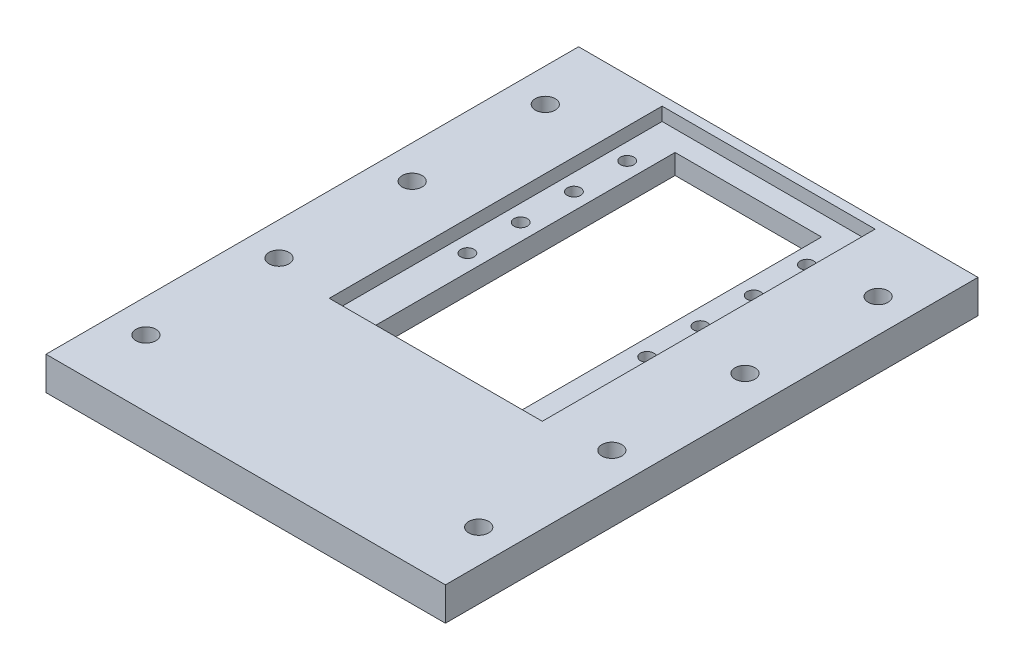
ISO-10303-21;
HEADER;
FILE_DESCRIPTION(('STEP AP214'),'2;1');
FILE_NAME('part.step','',(''),(''),'','','');
FILE_SCHEMA(('AUTOMOTIVE_DESIGN { 1 0 10303 214 1 1 1 1 }'));
ENDSEC;
DATA;
#1=APPLICATION_CONTEXT('core data for automotive mechanical design processes');
#2=APPLICATION_PROTOCOL_DEFINITION('international standard','automotive_design',2000,#1);
#3=PRODUCT_CONTEXT('',#1,'mechanical');
#4=PRODUCT('Part','Part','',(#3));
#5=PRODUCT_RELATED_PRODUCT_CATEGORY('part','',(#4));
#6=PRODUCT_DEFINITION_FORMATION('','',#4);
#7=PRODUCT_DEFINITION_CONTEXT('part definition',#1,'design');
#8=PRODUCT_DEFINITION('design','',#6,#7);
#9=PRODUCT_DEFINITION_SHAPE('','',#8);
#10=(LENGTH_UNIT() NAMED_UNIT(*) SI_UNIT(.MILLI.,.METRE.));
#11=(NAMED_UNIT(*) PLANE_ANGLE_UNIT() SI_UNIT($,.RADIAN.));
#12=(NAMED_UNIT(*) SI_UNIT($,.STERADIAN.) SOLID_ANGLE_UNIT());
#13=UNCERTAINTY_MEASURE_WITH_UNIT(LENGTH_MEASURE(1.E-05),#10,'distance_accuracy_value','');
#14=(GEOMETRIC_REPRESENTATION_CONTEXT(3) GLOBAL_UNCERTAINTY_ASSIGNED_CONTEXT((#13)) GLOBAL_UNIT_ASSIGNED_CONTEXT((#10,
#11,#12)) REPRESENTATION_CONTEXT('',''));
#15=CARTESIAN_POINT('',(0.,0.,0.));
#16=DIRECTION('',(0.,0.,1.));
#17=DIRECTION('',(1.,0.,0.));
#18=AXIS2_PLACEMENT_3D('',#15,#16,#17);
#19=CARTESIAN_POINT('',(-13.5000000000002,5.,-22.8));
#20=DIRECTION('',(0.,-1.,0.));
#21=DIRECTION('',(0.,0.,-1.));
#22=AXIS2_PLACEMENT_3D('',#19,#20,#21);
#23=CYLINDRICAL_SURFACE('',#22,1.00000000000014);
#24=CARTESIAN_POINT('',(-13.5000000000002,0.,-22.8));
#25=DIRECTION('',(0.,1.,0.));
#26=DIRECTION('',(0.,0.,1.));
#27=AXIS2_PLACEMENT_3D('',#24,#25,#26);
#28=CIRCLE('',#27,1.00000000000014);
#29=CARTESIAN_POINT('',(-13.5000000000002,0.,-21.7999999999999));
#30=VERTEX_POINT('',#29);
#31=EDGE_CURVE('E343',#30,#30,#28,.T.);
#32=ORIENTED_EDGE('',*,*,#31,.F.);
#33=EDGE_LOOP('',(#32));
#34=FACE_BOUND('',#33,.T.);
#35=CARTESIAN_POINT('',(-13.5000000000002,3.,-22.8));
#36=DIRECTION('',(0.,1.,0.));
#37=DIRECTION('',(0.,0.,1.));
#38=AXIS2_PLACEMENT_3D('',#35,#36,#37);
#39=CIRCLE('',#38,1.00000000000014);
#40=CARTESIAN_POINT('',(-13.5000000000002,3.,-21.7999999999999));
#41=VERTEX_POINT('',#40);
#42=EDGE_CURVE('E219',#41,#41,#39,.T.);
#43=ORIENTED_EDGE('',*,*,#42,.T.);
#44=EDGE_LOOP('',(#43));
#45=FACE_BOUND('',#44,.T.);
#46=ADVANCED_FACE('F42',(#34,#45),#23,.F.);
#47=CARTESIAN_POINT('',(13.4999999999998,5.,-22.8));
#48=DIRECTION('',(0.,-1.,0.));
#49=DIRECTION('',(0.,0.,-1.));
#50=AXIS2_PLACEMENT_3D('',#47,#48,#49);
#51=CYLINDRICAL_SURFACE('',#50,1.00000000000014);
#52=CARTESIAN_POINT('',(13.4999999999998,0.,-22.8));
#53=DIRECTION('',(0.,1.,0.));
#54=DIRECTION('',(0.,0.,1.));
#55=AXIS2_PLACEMENT_3D('',#52,#53,#54);
#56=CIRCLE('',#55,1.00000000000014);
#57=CARTESIAN_POINT('',(13.4999999999998,0.,-21.7999999999999));
#58=VERTEX_POINT('',#57);
#59=EDGE_CURVE('E339',#58,#58,#56,.T.);
#60=ORIENTED_EDGE('',*,*,#59,.F.);
#61=EDGE_LOOP('',(#60));
#62=FACE_BOUND('',#61,.T.);
#63=CARTESIAN_POINT('',(13.4999999999998,3.,-22.8));
#64=DIRECTION('',(0.,1.,0.));
#65=DIRECTION('',(0.,0.,1.));
#66=AXIS2_PLACEMENT_3D('',#63,#64,#65);
#67=CIRCLE('',#66,1.00000000000014);
#68=CARTESIAN_POINT('',(13.4999999999998,3.,-21.7999999999999));
#69=VERTEX_POINT('',#68);
#70=EDGE_CURVE('E215',#69,#69,#67,.T.);
#71=ORIENTED_EDGE('',*,*,#70,.T.);
#72=EDGE_LOOP('',(#71));
#73=FACE_BOUND('',#72,.T.);
#74=ADVANCED_FACE('F438',(#62,#73),#51,.F.);
#75=CARTESIAN_POINT('',(-13.5000000000002,5.,-14.8));
#76=DIRECTION('',(0.,-1.,0.));
#77=DIRECTION('',(0.,0.,-1.));
#78=AXIS2_PLACEMENT_3D('',#75,#76,#77);
#79=CYLINDRICAL_SURFACE('',#78,1.);
#80=CARTESIAN_POINT('',(-13.5000000000002,0.,-14.8));
#81=DIRECTION('',(0.,1.,0.));
#82=DIRECTION('',(0.,0.,1.));
#83=AXIS2_PLACEMENT_3D('',#80,#81,#82);
#84=CIRCLE('',#83,1.);
#85=CARTESIAN_POINT('',(-13.5000000000002,0.,-13.8));
#86=VERTEX_POINT('',#85);
#87=EDGE_CURVE('E335',#86,#86,#84,.T.);
#88=ORIENTED_EDGE('',*,*,#87,.F.);
#89=EDGE_LOOP('',(#88));
#90=FACE_BOUND('',#89,.T.);
#91=CARTESIAN_POINT('',(-13.5000000000002,3.,-14.8));
#92=DIRECTION('',(0.,1.,0.));
#93=DIRECTION('',(0.,0.,1.));
#94=AXIS2_PLACEMENT_3D('',#91,#92,#93);
#95=CIRCLE('',#94,1.);
#96=CARTESIAN_POINT('',(-13.5000000000002,3.,-13.8));
#97=VERTEX_POINT('',#96);
#98=EDGE_CURVE('E211',#97,#97,#95,.T.);
#99=ORIENTED_EDGE('',*,*,#98,.T.);
#100=EDGE_LOOP('',(#99));
#101=FACE_BOUND('',#100,.T.);
#102=ADVANCED_FACE('F445',(#90,#101),#79,.F.);
#103=CARTESIAN_POINT('',(-13.5000000000001,5.,-6.8));
#104=DIRECTION('',(0.,-1.,0.));
#105=DIRECTION('',(0.,0.,-1.));
#106=AXIS2_PLACEMENT_3D('',#103,#104,#105);
#107=CYLINDRICAL_SURFACE('',#106,1.);
#108=CARTESIAN_POINT('',(-13.5000000000001,0.,-6.8));
#109=DIRECTION('',(0.,1.,0.));
#110=DIRECTION('',(0.,0.,1.));
#111=AXIS2_PLACEMENT_3D('',#108,#109,#110);
#112=CIRCLE('',#111,1.);
#113=CARTESIAN_POINT('',(-13.5000000000001,0.,-5.8));
#114=VERTEX_POINT('',#113);
#115=EDGE_CURVE('E331',#114,#114,#112,.T.);
#116=ORIENTED_EDGE('',*,*,#115,.F.);
#117=EDGE_LOOP('',(#116));
#118=FACE_BOUND('',#117,.T.);
#119=CARTESIAN_POINT('',(-13.5000000000001,3.,-6.8));
#120=DIRECTION('',(0.,1.,0.));
#121=DIRECTION('',(0.,0.,1.));
#122=AXIS2_PLACEMENT_3D('',#119,#120,#121);
#123=CIRCLE('',#122,1.);
#124=CARTESIAN_POINT('',(-13.5000000000001,3.,-5.8));
#125=VERTEX_POINT('',#124);
#126=EDGE_CURVE('E207',#125,#125,#123,.T.);
#127=ORIENTED_EDGE('',*,*,#126,.T.);
#128=EDGE_LOOP('',(#127));
#129=FACE_BOUND('',#128,.T.);
#130=ADVANCED_FACE('F453',(#118,#129),#107,.F.);
#131=CARTESIAN_POINT('',(13.4999999999998,5.,-14.8));
#132=DIRECTION('',(0.,-1.,0.));
#133=DIRECTION('',(0.,0.,-1.));
#134=AXIS2_PLACEMENT_3D('',#131,#132,#133);
#135=CYLINDRICAL_SURFACE('',#134,1.);
#136=CARTESIAN_POINT('',(13.4999999999998,0.,-14.8));
#137=DIRECTION('',(0.,1.,0.));
#138=DIRECTION('',(0.,0.,1.));
#139=AXIS2_PLACEMENT_3D('',#136,#137,#138);
#140=CIRCLE('',#139,1.);
#141=CARTESIAN_POINT('',(13.4999999999998,0.,-13.8));
#142=VERTEX_POINT('',#141);
#143=EDGE_CURVE('E327',#142,#142,#140,.T.);
#144=ORIENTED_EDGE('',*,*,#143,.F.);
#145=EDGE_LOOP('',(#144));
#146=FACE_BOUND('',#145,.T.);
#147=CARTESIAN_POINT('',(13.4999999999998,3.,-14.8));
#148=DIRECTION('',(0.,1.,0.));
#149=DIRECTION('',(0.,0.,1.));
#150=AXIS2_PLACEMENT_3D('',#147,#148,#149);
#151=CIRCLE('',#150,1.);
#152=CARTESIAN_POINT('',(13.4999999999998,3.,-13.8));
#153=VERTEX_POINT('',#152);
#154=EDGE_CURVE('E203',#153,#153,#151,.T.);
#155=ORIENTED_EDGE('',*,*,#154,.T.);
#156=EDGE_LOOP('',(#155));
#157=FACE_BOUND('',#156,.T.);
#158=ADVANCED_FACE('F457',(#146,#157),#135,.F.);
#159=CARTESIAN_POINT('',(13.4999999999999,5.,-6.8));
#160=DIRECTION('',(0.,-1.,0.));
#161=DIRECTION('',(0.,0.,-1.));
#162=AXIS2_PLACEMENT_3D('',#159,#160,#161);
#163=CYLINDRICAL_SURFACE('',#162,1.);
#164=CARTESIAN_POINT('',(13.4999999999999,0.,-6.8));
#165=DIRECTION('',(0.,1.,0.));
#166=DIRECTION('',(0.,0.,1.));
#167=AXIS2_PLACEMENT_3D('',#164,#165,#166);
#168=CIRCLE('',#167,1.);
#169=CARTESIAN_POINT('',(13.4999999999999,0.,-5.8));
#170=VERTEX_POINT('',#169);
#171=EDGE_CURVE('E323',#170,#170,#168,.T.);
#172=ORIENTED_EDGE('',*,*,#171,.F.);
#173=EDGE_LOOP('',(#172));
#174=FACE_BOUND('',#173,.T.);
#175=CARTESIAN_POINT('',(13.4999999999999,3.,-6.8));
#176=DIRECTION('',(0.,1.,0.));
#177=DIRECTION('',(0.,0.,1.));
#178=AXIS2_PLACEMENT_3D('',#175,#176,#177);
#179=CIRCLE('',#178,1.);
#180=CARTESIAN_POINT('',(13.4999999999999,3.,-5.8));
#181=VERTEX_POINT('',#180);
#182=EDGE_CURVE('E199',#181,#181,#179,.T.);
#183=ORIENTED_EDGE('',*,*,#182,.T.);
#184=EDGE_LOOP('',(#183));
#185=FACE_BOUND('',#184,.T.);
#186=ADVANCED_FACE('F461',(#174,#185),#163,.F.);
#187=CARTESIAN_POINT('',(-13.5000000000003,5.,-30.8));
#188=DIRECTION('',(0.,-1.,0.));
#189=DIRECTION('',(0.,0.,-1.));
#190=AXIS2_PLACEMENT_3D('',#187,#188,#189);
#191=CYLINDRICAL_SURFACE('',#190,1.);
#192=CARTESIAN_POINT('',(-13.5000000000003,0.,-30.8));
#193=DIRECTION('',(0.,1.,0.));
#194=DIRECTION('',(0.,0.,1.));
#195=AXIS2_PLACEMENT_3D('',#192,#193,#194);
#196=CIRCLE('',#195,1.);
#197=CARTESIAN_POINT('',(-13.5000000000003,0.,-29.8));
#198=VERTEX_POINT('',#197);
#199=EDGE_CURVE('E319',#198,#198,#196,.T.);
#200=ORIENTED_EDGE('',*,*,#199,.F.);
#201=EDGE_LOOP('',(#200));
#202=FACE_BOUND('',#201,.T.);
#203=CARTESIAN_POINT('',(-13.5000000000003,3.,-30.8));
#204=DIRECTION('',(0.,1.,0.));
#205=DIRECTION('',(0.,0.,1.));
#206=AXIS2_PLACEMENT_3D('',#203,#204,#205);
#207=CIRCLE('',#206,1.);
#208=CARTESIAN_POINT('',(-13.5000000000003,3.,-29.8));
#209=VERTEX_POINT('',#208);
#210=EDGE_CURVE('E195',#209,#209,#207,.T.);
#211=ORIENTED_EDGE('',*,*,#210,.T.);
#212=EDGE_LOOP('',(#211));
#213=FACE_BOUND('',#212,.T.);
#214=ADVANCED_FACE('F465',(#202,#213),#191,.F.);
#215=CARTESIAN_POINT('',(13.4999999999997,5.,-30.8));
#216=DIRECTION('',(0.,-1.,0.));
#217=DIRECTION('',(0.,0.,-1.));
#218=AXIS2_PLACEMENT_3D('',#215,#216,#217);
#219=CYLINDRICAL_SURFACE('',#218,1.);
#220=CARTESIAN_POINT('',(13.4999999999997,0.,-30.8));
#221=DIRECTION('',(0.,1.,0.));
#222=DIRECTION('',(0.,0.,1.));
#223=AXIS2_PLACEMENT_3D('',#220,#221,#222);
#224=CIRCLE('',#223,1.);
#225=CARTESIAN_POINT('',(13.4999999999997,0.,-29.8));
#226=VERTEX_POINT('',#225);
#227=EDGE_CURVE('E315',#226,#226,#224,.T.);
#228=ORIENTED_EDGE('',*,*,#227,.F.);
#229=EDGE_LOOP('',(#228));
#230=FACE_BOUND('',#229,.T.);
#231=CARTESIAN_POINT('',(13.4999999999997,3.,-30.8));
#232=DIRECTION('',(0.,1.,0.));
#233=DIRECTION('',(0.,0.,1.));
#234=AXIS2_PLACEMENT_3D('',#231,#232,#233);
#235=CIRCLE('',#234,1.);
#236=CARTESIAN_POINT('',(13.4999999999997,3.,-29.8));
#237=VERTEX_POINT('',#236);
#238=EDGE_CURVE('E191',#237,#237,#235,.T.);
#239=ORIENTED_EDGE('',*,*,#238,.T.);
#240=EDGE_LOOP('',(#239));
#241=FACE_BOUND('',#240,.T.);
#242=ADVANCED_FACE('F469',(#230,#241),#219,.F.);
#243=CARTESIAN_POINT('',(11.,5.,-35.5));
#244=DIRECTION('',(-1.,0.,0.));
#245=DIRECTION('',(0.,0.,1.));
#246=AXIS2_PLACEMENT_3D('',#243,#244,#245);
#247=PLANE('',#246);
#248=DIRECTION('',(0.,-1.,0.));
#249=VECTOR('',#248,1.);
#250=CARTESIAN_POINT('',(11.,5.,9.49999999999998));
#251=LINE('',#250,#249);
#252=CARTESIAN_POINT('',(11.,3.,9.49999999999998));
#253=VERTEX_POINT('',#252);
#254=CARTESIAN_POINT('',(11.,0.,9.49999999999998));
#255=VERTEX_POINT('',#254);
#256=EDGE_CURVE('E303',#253,#255,#251,.T.);
#257=ORIENTED_EDGE('',*,*,#256,.F.);
#258=DIRECTION('',(0.,0.,-1.));
#259=VECTOR('',#258,1.);
#260=CARTESIAN_POINT('',(11.,3.,-35.5));
#261=LINE('',#260,#259);
#262=CARTESIAN_POINT('',(11.,3.,-35.5));
#263=VERTEX_POINT('',#262);
#264=EDGE_CURVE('E66',#253,#263,#261,.T.);
#265=ORIENTED_EDGE('',*,*,#264,.T.);
#266=DIRECTION('',(0.,-1.,0.));
#267=VECTOR('',#266,1.);
#268=CARTESIAN_POINT('',(11.,5.,-35.5));
#269=LINE('',#268,#267);
#270=CARTESIAN_POINT('',(11.,0.,-35.5));
#271=VERTEX_POINT('',#270);
#272=EDGE_CURVE('E312',#263,#271,#269,.T.);
#273=ORIENTED_EDGE('',*,*,#272,.T.);
#274=DIRECTION('',(0.,0.,-1.));
#275=VECTOR('',#274,1.);
#276=CARTESIAN_POINT('',(11.,0.,-35.5));
#277=LINE('',#276,#275);
#278=EDGE_CURVE('E284',#255,#271,#277,.T.);
#279=ORIENTED_EDGE('',*,*,#278,.F.);
#280=EDGE_LOOP('',(#257,#265,#273,#279));
#281=FACE_BOUND('',#280,.T.);
#282=ADVANCED_FACE('F473',(#281),#247,.T.);
#283=CARTESIAN_POINT('',(-11.,5.,-35.5));
#284=DIRECTION('',(0.,0.,1.));
#285=DIRECTION('',(1.,0.,0.));
#286=AXIS2_PLACEMENT_3D('',#283,#284,#285);
#287=PLANE('',#286);
#288=ORIENTED_EDGE('',*,*,#272,.F.);
#289=DIRECTION('',(-1.,0.,0.));
#290=VECTOR('',#289,1.);
#291=CARTESIAN_POINT('',(-11.,3.,-35.5));
#292=LINE('',#291,#290);
#293=CARTESIAN_POINT('',(-11.,3.,-35.5));
#294=VERTEX_POINT('',#293);
#295=EDGE_CURVE('E185',#263,#294,#292,.T.);
#296=ORIENTED_EDGE('',*,*,#295,.T.);
#297=DIRECTION('',(0.,-1.,0.));
#298=VECTOR('',#297,1.);
#299=CARTESIAN_POINT('',(-11.,5.,-35.5));
#300=LINE('',#299,#298);
#301=CARTESIAN_POINT('',(-11.,0.,-35.5));
#302=VERTEX_POINT('',#301);
#303=EDGE_CURVE('E309',#294,#302,#300,.T.);
#304=ORIENTED_EDGE('',*,*,#303,.T.);
#305=DIRECTION('',(-1.,0.,0.));
#306=VECTOR('',#305,1.);
#307=CARTESIAN_POINT('',(-11.,0.,-35.5));
#308=LINE('',#307,#306);
#309=EDGE_CURVE('E291',#271,#302,#308,.T.);
#310=ORIENTED_EDGE('',*,*,#309,.F.);
#311=EDGE_LOOP('',(#288,#296,#304,#310));
#312=FACE_BOUND('',#311,.T.);
#313=ADVANCED_FACE('F477',(#312),#287,.T.);
#314=CARTESIAN_POINT('',(-11.,5.,-35.5));
#315=DIRECTION('',(1.,0.,0.));
#316=DIRECTION('',(0.,0.,-1.));
#317=AXIS2_PLACEMENT_3D('',#314,#315,#316);
#318=PLANE('',#317);
#319=ORIENTED_EDGE('',*,*,#303,.F.);
#320=DIRECTION('',(0.,0.,1.));
#321=VECTOR('',#320,1.);
#322=CARTESIAN_POINT('',(-11.,3.,-35.5));
#323=LINE('',#322,#321);
#324=CARTESIAN_POINT('',(-11.,3.,9.49999999999998));
#325=VERTEX_POINT('',#324);
#326=EDGE_CURVE('E176',#294,#325,#323,.T.);
#327=ORIENTED_EDGE('',*,*,#326,.T.);
#328=DIRECTION('',(0.,-1.,0.));
#329=VECTOR('',#328,1.);
#330=CARTESIAN_POINT('',(-11.,5.,9.49999999999998));
#331=LINE('',#330,#329);
#332=CARTESIAN_POINT('',(-11.,0.,9.49999999999998));
#333=VERTEX_POINT('',#332);
#334=EDGE_CURVE('E306',#325,#333,#331,.T.);
#335=ORIENTED_EDGE('',*,*,#334,.T.);
#336=DIRECTION('',(0.,0.,1.));
#337=VECTOR('',#336,1.);
#338=CARTESIAN_POINT('',(-11.,0.,-35.5));
#339=LINE('',#338,#337);
#340=EDGE_CURVE('E295',#302,#333,#339,.T.);
#341=ORIENTED_EDGE('',*,*,#340,.F.);
#342=EDGE_LOOP('',(#319,#327,#335,#341));
#343=FACE_BOUND('',#342,.T.);
#344=ADVANCED_FACE('F481',(#343),#318,.T.);
#345=CARTESIAN_POINT('',(-11.,5.,9.49999999999998));
#346=DIRECTION('',(0.,0.,-1.));
#347=DIRECTION('',(-1.,0.,0.));
#348=AXIS2_PLACEMENT_3D('',#345,#346,#347);
#349=PLANE('',#348);
#350=ORIENTED_EDGE('',*,*,#334,.F.);
#351=DIRECTION('',(1.,0.,0.));
#352=VECTOR('',#351,1.);
#353=CARTESIAN_POINT('',(-11.,3.,9.49999999999998));
#354=LINE('',#353,#352);
#355=EDGE_CURVE('E11',#325,#253,#354,.T.);
#356=ORIENTED_EDGE('',*,*,#355,.T.);
#357=ORIENTED_EDGE('',*,*,#256,.T.);
#358=DIRECTION('',(1.,0.,0.));
#359=VECTOR('',#358,1.);
#360=CARTESIAN_POINT('',(-11.,0.,9.49999999999998));
#361=LINE('',#360,#359);
#362=EDGE_CURVE('E299',#333,#255,#361,.T.);
#363=ORIENTED_EDGE('',*,*,#362,.F.);
#364=EDGE_LOOP('',(#350,#356,#357,#363));
#365=FACE_BOUND('',#364,.T.);
#366=ADVANCED_FACE('F410',(#365),#349,.T.);
#367=CARTESIAN_POINT('',(0.,5.,0.));
#368=DIRECTION('',(0.,1.,0.));
#369=DIRECTION('',(0.,0.,1.));
#370=AXIS2_PLACEMENT_3D('',#367,#368,#369);
#371=PLANE('',#370);
#372=DIRECTION('',(0.,0.,-1.));
#373=VECTOR('',#372,1.);
#374=CARTESIAN_POINT('',(16.,5.,-38.55));
#375=LINE('',#374,#373);
#376=CARTESIAN_POINT('',(16.,5.,11.45));
#377=VERTEX_POINT('',#376);
#378=CARTESIAN_POINT('',(16.,5.,-38.55));
#379=VERTEX_POINT('',#378);
#380=EDGE_CURVE('E58',#377,#379,#375,.T.);
#381=ORIENTED_EDGE('',*,*,#380,.F.);
#382=DIRECTION('',(1.,0.,0.));
#383=VECTOR('',#382,1.);
#384=CARTESIAN_POINT('',(-16.,5.,11.45));
#385=LINE('',#384,#383);
#386=CARTESIAN_POINT('',(-16.,5.,11.45));
#387=VERTEX_POINT('',#386);
#388=EDGE_CURVE('E154',#387,#377,#385,.T.);
#389=ORIENTED_EDGE('',*,*,#388,.F.);
#390=DIRECTION('',(0.,0.,1.));
#391=VECTOR('',#390,1.);
#392=CARTESIAN_POINT('',(-16.,5.,-38.55));
#393=LINE('',#392,#391);
#394=CARTESIAN_POINT('',(-16.,5.,-38.55));
#395=VERTEX_POINT('',#394);
#396=EDGE_CURVE('E158',#395,#387,#393,.T.);
#397=ORIENTED_EDGE('',*,*,#396,.F.);
#398=DIRECTION('',(-1.,0.,0.));
#399=VECTOR('',#398,1.);
#400=CARTESIAN_POINT('',(-16.,5.,-38.55));
#401=LINE('',#400,#399);
#402=EDGE_CURVE('E167',#379,#395,#401,.T.);
#403=ORIENTED_EDGE('',*,*,#402,.F.);
#404=EDGE_LOOP('',(#381,#389,#397,#403));
#405=FACE_BOUND('',#404,.T.);
#406=CARTESIAN_POINT('',(25.0000000000004,5.,10.));
#407=DIRECTION('',(0.,1.,0.));
#408=DIRECTION('',(0.,0.,1.));
#409=AXIS2_PLACEMENT_3D('',#406,#407,#408);
#410=CIRCLE('',#409,1.5);
#411=CARTESIAN_POINT('',(25.0000000000004,5.,11.5));
#412=VERTEX_POINT('',#411);
#413=EDGE_CURVE('E232',#412,#412,#410,.T.);
#414=ORIENTED_EDGE('',*,*,#413,.F.);
#415=EDGE_LOOP('',(#414));
#416=FACE_BOUND('',#415,.T.);
#417=CARTESIAN_POINT('',(-25.,5.,-30.));
#418=DIRECTION('',(0.,1.,0.));
#419=DIRECTION('',(0.,0.,1.));
#420=AXIS2_PLACEMENT_3D('',#417,#418,#419);
#421=CIRCLE('',#420,1.5);
#422=CARTESIAN_POINT('',(-25.,5.,-28.5));
#423=VERTEX_POINT('',#422);
#424=EDGE_CURVE('E248',#423,#423,#421,.T.);
#425=ORIENTED_EDGE('',*,*,#424,.F.);
#426=EDGE_LOOP('',(#425));
#427=FACE_BOUND('',#426,.T.);
#428=CARTESIAN_POINT('',(-24.9999999999996,5.,10.));
#429=DIRECTION('',(0.,1.,0.));
#430=DIRECTION('',(0.,0.,1.));
#431=AXIS2_PLACEMENT_3D('',#428,#429,#430);
#432=CIRCLE('',#431,1.5);
#433=CARTESIAN_POINT('',(-24.9999999999996,5.,11.5));
#434=VERTEX_POINT('',#433);
#435=EDGE_CURVE('E264',#434,#434,#432,.T.);
#436=ORIENTED_EDGE('',*,*,#435,.F.);
#437=EDGE_LOOP('',(#436));
#438=FACE_BOUND('',#437,.T.);
#439=CARTESIAN_POINT('',(25.,5.,-30.));
#440=DIRECTION('',(0.,1.,0.));
#441=DIRECTION('',(0.,0.,1.));
#442=AXIS2_PLACEMENT_3D('',#439,#440,#441);
#443=CIRCLE('',#442,1.5);
#444=CARTESIAN_POINT('',(25.,5.,-28.5));
#445=VERTEX_POINT('',#444);
#446=EDGE_CURVE('E280',#445,#445,#443,.T.);
#447=ORIENTED_EDGE('',*,*,#446,.F.);
#448=EDGE_LOOP('',(#447));
#449=FACE_BOUND('',#448,.T.);
#450=DIRECTION('',(0.,0.,-1.));
#451=VECTOR('',#450,1.);
#452=CARTESIAN_POINT('',(30.,5.,-40.));
#453=LINE('',#452,#451);
#454=CARTESIAN_POINT('',(30.,5.,40.));
#455=VERTEX_POINT('',#454);
#456=CARTESIAN_POINT('',(30.,5.,-40.));
#457=VERTEX_POINT('',#456);
#458=EDGE_CURVE('E348',#455,#457,#453,.T.);
#459=ORIENTED_EDGE('',*,*,#458,.T.);
#460=DIRECTION('',(-1.,0.,0.));
#461=VECTOR('',#460,1.);
#462=CARTESIAN_POINT('',(-30.,5.,-40.));
#463=LINE('',#462,#461);
#464=CARTESIAN_POINT('',(-30.,5.,-40.));
#465=VERTEX_POINT('',#464);
#466=EDGE_CURVE('E352',#457,#465,#463,.T.);
#467=ORIENTED_EDGE('',*,*,#466,.T.);
#468=DIRECTION('',(0.,0.,1.));
#469=VECTOR('',#468,1.);
#470=CARTESIAN_POINT('',(-30.,5.,-40.));
#471=LINE('',#470,#469);
#472=CARTESIAN_POINT('',(-30.,5.,40.));
#473=VERTEX_POINT('',#472);
#474=EDGE_CURVE('E356',#465,#473,#471,.T.);
#475=ORIENTED_EDGE('',*,*,#474,.T.);
#476=DIRECTION('',(1.,0.,0.));
#477=VECTOR('',#476,1.);
#478=CARTESIAN_POINT('',(-30.,5.,40.));
#479=LINE('',#478,#477);
#480=EDGE_CURVE('E359',#473,#455,#479,.T.);
#481=ORIENTED_EDGE('',*,*,#480,.T.);
#482=EDGE_LOOP('',(#459,#467,#475,#481));
#483=FACE_BOUND('',#482,.T.);
#484=CARTESIAN_POINT('',(-24.9999999999998,5.,-10.));
#485=DIRECTION('',(0.,1.,0.));
#486=DIRECTION('',(0.,0.,1.));
#487=AXIS2_PLACEMENT_3D('',#484,#485,#486);
#488=CIRCLE('',#487,1.5);
#489=CARTESIAN_POINT('',(-24.9999999999998,5.,-8.5));
#490=VERTEX_POINT('',#489);
#491=EDGE_CURVE('E272',#490,#490,#488,.T.);
#492=ORIENTED_EDGE('',*,*,#491,.F.);
#493=EDGE_LOOP('',(#492));
#494=FACE_BOUND('',#493,.T.);
#495=CARTESIAN_POINT('',(-24.9999999999994,5.,30.));
#496=DIRECTION('',(0.,1.,0.));
#497=DIRECTION('',(0.,0.,1.));
#498=AXIS2_PLACEMENT_3D('',#495,#496,#497);
#499=CIRCLE('',#498,1.5);
#500=CARTESIAN_POINT('',(-24.9999999999994,5.,31.5));
#501=VERTEX_POINT('',#500);
#502=EDGE_CURVE('E256',#501,#501,#499,.T.);
#503=ORIENTED_EDGE('',*,*,#502,.F.);
#504=EDGE_LOOP('',(#503));
#505=FACE_BOUND('',#504,.T.);
#506=CARTESIAN_POINT('',(25.0000000000002,5.,-10.));
#507=DIRECTION('',(0.,1.,0.));
#508=DIRECTION('',(0.,0.,1.));
#509=AXIS2_PLACEMENT_3D('',#506,#507,#508);
#510=CIRCLE('',#509,1.5);
#511=CARTESIAN_POINT('',(25.0000000000002,5.,-8.5));
#512=VERTEX_POINT('',#511);
#513=EDGE_CURVE('E240',#512,#512,#510,.T.);
#514=ORIENTED_EDGE('',*,*,#513,.F.);
#515=EDGE_LOOP('',(#514));
#516=FACE_BOUND('',#515,.T.);
#517=CARTESIAN_POINT('',(25.0000000000006,5.,30.));
#518=DIRECTION('',(0.,1.,0.));
#519=DIRECTION('',(0.,0.,1.));
#520=AXIS2_PLACEMENT_3D('',#517,#518,#519);
#521=CIRCLE('',#520,1.5);
#522=CARTESIAN_POINT('',(25.0000000000006,5.,31.5));
#523=VERTEX_POINT('',#522);
#524=EDGE_CURVE('E224',#523,#523,#521,.T.);
#525=ORIENTED_EDGE('',*,*,#524,.F.);
#526=EDGE_LOOP('',(#525));
#527=FACE_BOUND('',#526,.T.);
#528=ADVANCED_FACE('F407',(#405,#416,#427,#438,#449,#483,#494,#505,#516,#527),#371,.T.);
#529=CARTESIAN_POINT('',(0.,0.,0.));
#530=DIRECTION('',(0.,1.,0.));
#531=DIRECTION('',(0.,0.,1.));
#532=AXIS2_PLACEMENT_3D('',#529,#530,#531);
#533=PLANE('',#532);
#534=ORIENTED_EDGE('',*,*,#227,.T.);
#535=EDGE_LOOP('',(#534));
#536=FACE_BOUND('',#535,.T.);
#537=ORIENTED_EDGE('',*,*,#199,.T.);
#538=EDGE_LOOP('',(#537));
#539=FACE_BOUND('',#538,.T.);
#540=ORIENTED_EDGE('',*,*,#171,.T.);
#541=EDGE_LOOP('',(#540));
#542=FACE_BOUND('',#541,.T.);
#543=ORIENTED_EDGE('',*,*,#143,.T.);
#544=EDGE_LOOP('',(#543));
#545=FACE_BOUND('',#544,.T.);
#546=ORIENTED_EDGE('',*,*,#115,.T.);
#547=EDGE_LOOP('',(#546));
#548=FACE_BOUND('',#547,.T.);
#549=ORIENTED_EDGE('',*,*,#87,.T.);
#550=EDGE_LOOP('',(#549));
#551=FACE_BOUND('',#550,.T.);
#552=ORIENTED_EDGE('',*,*,#59,.T.);
#553=EDGE_LOOP('',(#552));
#554=FACE_BOUND('',#553,.T.);
#555=ORIENTED_EDGE('',*,*,#31,.T.);
#556=EDGE_LOOP('',(#555));
#557=FACE_BOUND('',#556,.T.);
#558=DIRECTION('',(0.,0.,-1.));
#559=VECTOR('',#558,1.);
#560=CARTESIAN_POINT('',(30.,0.,-40.));
#561=LINE('',#560,#559);
#562=CARTESIAN_POINT('',(30.,0.,40.));
#563=VERTEX_POINT('',#562);
#564=CARTESIAN_POINT('',(30.,0.,-40.));
#565=VERTEX_POINT('',#564);
#566=EDGE_CURVE('E347',#563,#565,#561,.T.);
#567=ORIENTED_EDGE('',*,*,#566,.F.);
#568=DIRECTION('',(1.,0.,0.));
#569=VECTOR('',#568,1.);
#570=CARTESIAN_POINT('',(-30.,0.,40.));
#571=LINE('',#570,#569);
#572=CARTESIAN_POINT('',(-30.,0.,40.));
#573=VERTEX_POINT('',#572);
#574=EDGE_CURVE('E353',#573,#563,#571,.T.);
#575=ORIENTED_EDGE('',*,*,#574,.F.);
#576=DIRECTION('',(0.,0.,1.));
#577=VECTOR('',#576,1.);
#578=CARTESIAN_POINT('',(-30.,0.,-40.));
#579=LINE('',#578,#577);
#580=CARTESIAN_POINT('',(-30.,0.,-40.));
#581=VERTEX_POINT('',#580);
#582=EDGE_CURVE('E369',#581,#573,#579,.T.);
#583=ORIENTED_EDGE('',*,*,#582,.F.);
#584=DIRECTION('',(-1.,0.,0.));
#585=VECTOR('',#584,1.);
#586=CARTESIAN_POINT('',(-30.,0.,-40.));
#587=LINE('',#586,#585);
#588=EDGE_CURVE('E366',#565,#581,#587,.T.);
#589=ORIENTED_EDGE('',*,*,#588,.F.);
#590=EDGE_LOOP('',(#567,#575,#583,#589));
#591=FACE_BOUND('',#590,.T.);
#592=ORIENTED_EDGE('',*,*,#278,.T.);
#593=ORIENTED_EDGE('',*,*,#309,.T.);
#594=ORIENTED_EDGE('',*,*,#340,.T.);
#595=ORIENTED_EDGE('',*,*,#362,.T.);
#596=EDGE_LOOP('',(#592,#593,#594,#595));
#597=FACE_BOUND('',#596,.T.);
#598=CARTESIAN_POINT('',(25.,0.,-30.));
#599=DIRECTION('',(0.,1.,0.));
#600=DIRECTION('',(0.,0.,1.));
#601=AXIS2_PLACEMENT_3D('',#598,#599,#600);
#602=CIRCLE('',#601,1.5);
#603=CARTESIAN_POINT('',(25.,0.,-28.5));
#604=VERTEX_POINT('',#603);
#605=EDGE_CURVE('E276',#604,#604,#602,.T.);
#606=ORIENTED_EDGE('',*,*,#605,.T.);
#607=EDGE_LOOP('',(#606));
#608=FACE_BOUND('',#607,.T.);
#609=CARTESIAN_POINT('',(-24.9999999999998,0.,-10.));
#610=DIRECTION('',(0.,1.,0.));
#611=DIRECTION('',(0.,0.,1.));
#612=AXIS2_PLACEMENT_3D('',#609,#610,#611);
#613=CIRCLE('',#612,1.5);
#614=CARTESIAN_POINT('',(-24.9999999999998,0.,-8.5));
#615=VERTEX_POINT('',#614);
#616=EDGE_CURVE('E268',#615,#615,#613,.T.);
#617=ORIENTED_EDGE('',*,*,#616,.T.);
#618=EDGE_LOOP('',(#617));
#619=FACE_BOUND('',#618,.T.);
#620=CARTESIAN_POINT('',(-24.9999999999996,0.,10.));
#621=DIRECTION('',(0.,1.,0.));
#622=DIRECTION('',(0.,0.,1.));
#623=AXIS2_PLACEMENT_3D('',#620,#621,#622);
#624=CIRCLE('',#623,1.5);
#625=CARTESIAN_POINT('',(-24.9999999999996,0.,11.5));
#626=VERTEX_POINT('',#625);
#627=EDGE_CURVE('E260',#626,#626,#624,.T.);
#628=ORIENTED_EDGE('',*,*,#627,.T.);
#629=EDGE_LOOP('',(#628));
#630=FACE_BOUND('',#629,.T.);
#631=CARTESIAN_POINT('',(-24.9999999999994,0.,30.));
#632=DIRECTION('',(0.,1.,0.));
#633=DIRECTION('',(0.,0.,1.));
#634=AXIS2_PLACEMENT_3D('',#631,#632,#633);
#635=CIRCLE('',#634,1.5);
#636=CARTESIAN_POINT('',(-24.9999999999994,0.,31.5));
#637=VERTEX_POINT('',#636);
#638=EDGE_CURVE('E252',#637,#637,#635,.T.);
#639=ORIENTED_EDGE('',*,*,#638,.T.);
#640=EDGE_LOOP('',(#639));
#641=FACE_BOUND('',#640,.T.);
#642=CARTESIAN_POINT('',(-25.,0.,-30.));
#643=DIRECTION('',(0.,1.,0.));
#644=DIRECTION('',(0.,0.,1.));
#645=AXIS2_PLACEMENT_3D('',#642,#643,#644);
#646=CIRCLE('',#645,1.5);
#647=CARTESIAN_POINT('',(-25.,0.,-28.5));
#648=VERTEX_POINT('',#647);
#649=EDGE_CURVE('E244',#648,#648,#646,.T.);
#650=ORIENTED_EDGE('',*,*,#649,.T.);
#651=EDGE_LOOP('',(#650));
#652=FACE_BOUND('',#651,.T.);
#653=CARTESIAN_POINT('',(25.0000000000002,0.,-10.));
#654=DIRECTION('',(0.,1.,0.));
#655=DIRECTION('',(0.,0.,1.));
#656=AXIS2_PLACEMENT_3D('',#653,#654,#655);
#657=CIRCLE('',#656,1.5);
#658=CARTESIAN_POINT('',(25.0000000000002,0.,-8.5));
#659=VERTEX_POINT('',#658);
#660=EDGE_CURVE('E236',#659,#659,#657,.T.);
#661=ORIENTED_EDGE('',*,*,#660,.T.);
#662=EDGE_LOOP('',(#661));
#663=FACE_BOUND('',#662,.T.);
#664=CARTESIAN_POINT('',(25.0000000000004,0.,10.));
#665=DIRECTION('',(0.,1.,0.));
#666=DIRECTION('',(0.,0.,1.));
#667=AXIS2_PLACEMENT_3D('',#664,#665,#666);
#668=CIRCLE('',#667,1.5);
#669=CARTESIAN_POINT('',(25.0000000000004,0.,11.5));
#670=VERTEX_POINT('',#669);
#671=EDGE_CURVE('E228',#670,#670,#668,.T.);
#672=ORIENTED_EDGE('',*,*,#671,.T.);
#673=EDGE_LOOP('',(#672));
#674=FACE_BOUND('',#673,.T.);
#675=CARTESIAN_POINT('',(25.0000000000006,0.,30.));
#676=DIRECTION('',(0.,1.,0.));
#677=DIRECTION('',(0.,0.,1.));
#678=AXIS2_PLACEMENT_3D('',#675,#676,#677);
#679=CIRCLE('',#678,1.5);
#680=CARTESIAN_POINT('',(25.0000000000006,0.,31.5));
#681=VERTEX_POINT('',#680);
#682=EDGE_CURVE('E223',#681,#681,#679,.T.);
#683=ORIENTED_EDGE('',*,*,#682,.T.);
#684=EDGE_LOOP('',(#683));
#685=FACE_BOUND('',#684,.T.);
#686=ADVANCED_FACE('F396',(#536,#539,#542,#545,#548,#551,#554,#557,#591,#597,#608,#619,#630,
#641,#652,#663,#674,#685),#533,.F.);
#687=CARTESIAN_POINT('',(30.,5.,-40.));
#688=DIRECTION('',(-1.,0.,0.));
#689=DIRECTION('',(0.,0.,1.));
#690=AXIS2_PLACEMENT_3D('',#687,#688,#689);
#691=PLANE('',#690);
#692=ORIENTED_EDGE('',*,*,#566,.T.);
#693=DIRECTION('',(0.,-1.,0.));
#694=VECTOR('',#693,1.);
#695=CARTESIAN_POINT('',(30.,5.,-40.));
#696=LINE('',#695,#694);
#697=EDGE_CURVE('E51',#457,#565,#696,.T.);
#698=ORIENTED_EDGE('',*,*,#697,.F.);
#699=ORIENTED_EDGE('',*,*,#458,.F.);
#700=DIRECTION('',(0.,-1.,0.));
#701=VECTOR('',#700,1.);
#702=CARTESIAN_POINT('',(30.,5.,40.));
#703=LINE('',#702,#701);
#704=EDGE_CURVE('E362',#455,#563,#703,.T.);
#705=ORIENTED_EDGE('',*,*,#704,.T.);
#706=EDGE_LOOP('',(#692,#698,#699,#705));
#707=FACE_BOUND('',#706,.T.);
#708=ADVANCED_FACE('F44',(#707),#691,.F.);
#709=CARTESIAN_POINT('',(-30.,5.,-40.));
#710=DIRECTION('',(0.,0.,1.));
#711=DIRECTION('',(1.,0.,0.));
#712=AXIS2_PLACEMENT_3D('',#709,#710,#711);
#713=PLANE('',#712);
#714=ORIENTED_EDGE('',*,*,#588,.T.);
#715=DIRECTION('',(0.,-1.,0.));
#716=VECTOR('',#715,1.);
#717=CARTESIAN_POINT('',(-30.,5.,-40.));
#718=LINE('',#717,#716);
#719=EDGE_CURVE('E381',#465,#581,#718,.T.);
#720=ORIENTED_EDGE('',*,*,#719,.F.);
#721=ORIENTED_EDGE('',*,*,#466,.F.);
#722=ORIENTED_EDGE('',*,*,#697,.T.);
#723=EDGE_LOOP('',(#714,#720,#721,#722));
#724=FACE_BOUND('',#723,.T.);
#725=ADVANCED_FACE('F388',(#724),#713,.F.);
#726=CARTESIAN_POINT('',(-30.,5.,-40.));
#727=DIRECTION('',(1.,0.,0.));
#728=DIRECTION('',(0.,0.,-1.));
#729=AXIS2_PLACEMENT_3D('',#726,#727,#728);
#730=PLANE('',#729);
#731=ORIENTED_EDGE('',*,*,#582,.T.);
#732=DIRECTION('',(0.,-1.,0.));
#733=VECTOR('',#732,1.);
#734=CARTESIAN_POINT('',(-30.,5.,40.));
#735=LINE('',#734,#733);
#736=EDGE_CURVE('E377',#473,#573,#735,.T.);
#737=ORIENTED_EDGE('',*,*,#736,.F.);
#738=ORIENTED_EDGE('',*,*,#474,.F.);
#739=ORIENTED_EDGE('',*,*,#719,.T.);
#740=EDGE_LOOP('',(#731,#737,#738,#739));
#741=FACE_BOUND('',#740,.T.);
#742=ADVANCED_FACE('F401',(#741),#730,.F.);
#743=CARTESIAN_POINT('',(-30.,5.,40.));
#744=DIRECTION('',(0.,0.,-1.));
#745=DIRECTION('',(-1.,0.,0.));
#746=AXIS2_PLACEMENT_3D('',#743,#744,#745);
#747=PLANE('',#746);
#748=ORIENTED_EDGE('',*,*,#574,.T.);
#749=ORIENTED_EDGE('',*,*,#704,.F.);
#750=ORIENTED_EDGE('',*,*,#480,.F.);
#751=ORIENTED_EDGE('',*,*,#736,.T.);
#752=EDGE_LOOP('',(#748,#749,#750,#751));
#753=FACE_BOUND('',#752,.T.);
#754=ADVANCED_FACE('F405',(#753),#747,.F.);
#755=CARTESIAN_POINT('',(25.,5.,-30.));
#756=DIRECTION('',(0.,-1.,0.));
#757=DIRECTION('',(0.,0.,-1.));
#758=AXIS2_PLACEMENT_3D('',#755,#756,#757);
#759=CYLINDRICAL_SURFACE('',#758,1.5);
#760=ORIENTED_EDGE('',*,*,#446,.T.);
#761=EDGE_LOOP('',(#760));
#762=FACE_BOUND('',#761,.T.);
#763=ORIENTED_EDGE('',*,*,#605,.F.);
#764=EDGE_LOOP('',(#763));
#765=FACE_BOUND('',#764,.T.);
#766=ADVANCED_FACE('F489',(#762,#765),#759,.F.);
#767=CARTESIAN_POINT('',(-24.9999999999998,5.,-10.));
#768=DIRECTION('',(0.,-1.,0.));
#769=DIRECTION('',(0.,0.,-1.));
#770=AXIS2_PLACEMENT_3D('',#767,#768,#769);
#771=CYLINDRICAL_SURFACE('',#770,1.5);
#772=ORIENTED_EDGE('',*,*,#491,.T.);
#773=EDGE_LOOP('',(#772));
#774=FACE_BOUND('',#773,.T.);
#775=ORIENTED_EDGE('',*,*,#616,.F.);
#776=EDGE_LOOP('',(#775));
#777=FACE_BOUND('',#776,.T.);
#778=ADVANCED_FACE('F492',(#774,#777),#771,.F.);
#779=CARTESIAN_POINT('',(-24.9999999999996,5.,10.));
#780=DIRECTION('',(0.,-1.,0.));
#781=DIRECTION('',(0.,0.,-1.));
#782=AXIS2_PLACEMENT_3D('',#779,#780,#781);
#783=CYLINDRICAL_SURFACE('',#782,1.5);
#784=ORIENTED_EDGE('',*,*,#435,.T.);
#785=EDGE_LOOP('',(#784));
#786=FACE_BOUND('',#785,.T.);
#787=ORIENTED_EDGE('',*,*,#627,.F.);
#788=EDGE_LOOP('',(#787));
#789=FACE_BOUND('',#788,.T.);
#790=ADVANCED_FACE('F496',(#786,#789),#783,.F.);
#791=CARTESIAN_POINT('',(-24.9999999999994,5.,30.));
#792=DIRECTION('',(0.,-1.,0.));
#793=DIRECTION('',(0.,0.,-1.));
#794=AXIS2_PLACEMENT_3D('',#791,#792,#793);
#795=CYLINDRICAL_SURFACE('',#794,1.5);
#796=ORIENTED_EDGE('',*,*,#502,.T.);
#797=EDGE_LOOP('',(#796));
#798=FACE_BOUND('',#797,.T.);
#799=ORIENTED_EDGE('',*,*,#638,.F.);
#800=EDGE_LOOP('',(#799));
#801=FACE_BOUND('',#800,.T.);
#802=ADVANCED_FACE('F500',(#798,#801),#795,.F.);
#803=CARTESIAN_POINT('',(-25.,5.,-30.));
#804=DIRECTION('',(0.,-1.,0.));
#805=DIRECTION('',(0.,0.,-1.));
#806=AXIS2_PLACEMENT_3D('',#803,#804,#805);
#807=CYLINDRICAL_SURFACE('',#806,1.5);
#808=ORIENTED_EDGE('',*,*,#424,.T.);
#809=EDGE_LOOP('',(#808));
#810=FACE_BOUND('',#809,.T.);
#811=ORIENTED_EDGE('',*,*,#649,.F.);
#812=EDGE_LOOP('',(#811));
#813=FACE_BOUND('',#812,.T.);
#814=ADVANCED_FACE('F504',(#810,#813),#807,.F.);
#815=CARTESIAN_POINT('',(25.0000000000002,5.,-10.));
#816=DIRECTION('',(0.,-1.,0.));
#817=DIRECTION('',(0.,0.,-1.));
#818=AXIS2_PLACEMENT_3D('',#815,#816,#817);
#819=CYLINDRICAL_SURFACE('',#818,1.5);
#820=ORIENTED_EDGE('',*,*,#513,.T.);
#821=EDGE_LOOP('',(#820));
#822=FACE_BOUND('',#821,.T.);
#823=ORIENTED_EDGE('',*,*,#660,.F.);
#824=EDGE_LOOP('',(#823));
#825=FACE_BOUND('',#824,.T.);
#826=ADVANCED_FACE('F508',(#822,#825),#819,.F.);
#827=CARTESIAN_POINT('',(25.0000000000004,5.,10.));
#828=DIRECTION('',(0.,-1.,0.));
#829=DIRECTION('',(0.,0.,-1.));
#830=AXIS2_PLACEMENT_3D('',#827,#828,#829);
#831=CYLINDRICAL_SURFACE('',#830,1.5);
#832=ORIENTED_EDGE('',*,*,#413,.T.);
#833=EDGE_LOOP('',(#832));
#834=FACE_BOUND('',#833,.T.);
#835=ORIENTED_EDGE('',*,*,#671,.F.);
#836=EDGE_LOOP('',(#835));
#837=FACE_BOUND('',#836,.T.);
#838=ADVANCED_FACE('F424',(#834,#837),#831,.F.);
#839=CARTESIAN_POINT('',(25.0000000000006,5.,30.));
#840=DIRECTION('',(0.,-1.,0.));
#841=DIRECTION('',(0.,0.,-1.));
#842=AXIS2_PLACEMENT_3D('',#839,#840,#841);
#843=CYLINDRICAL_SURFACE('',#842,1.5);
#844=ORIENTED_EDGE('',*,*,#524,.T.);
#845=EDGE_LOOP('',(#844));
#846=FACE_BOUND('',#845,.T.);
#847=ORIENTED_EDGE('',*,*,#682,.F.);
#848=EDGE_LOOP('',(#847));
#849=FACE_BOUND('',#848,.T.);
#850=ADVANCED_FACE('F421',(#846,#849),#843,.F.);
#851=CARTESIAN_POINT('',(16.,3.,-38.55));
#852=DIRECTION('',(1.,0.,0.));
#853=DIRECTION('',(0.,0.,-1.));
#854=AXIS2_PLACEMENT_3D('',#851,#852,#853);
#855=PLANE('',#854);
#856=ORIENTED_EDGE('',*,*,#380,.T.);
#857=DIRECTION('',(0.,1.,0.));
#858=VECTOR('',#857,1.);
#859=CARTESIAN_POINT('',(16.,3.,-38.55));
#860=LINE('',#859,#858);
#861=CARTESIAN_POINT('',(16.,3.,-38.55));
#862=VERTEX_POINT('',#861);
#863=EDGE_CURVE('E129',#862,#379,#860,.T.);
#864=ORIENTED_EDGE('',*,*,#863,.F.);
#865=DIRECTION('',(0.,0.,-1.));
#866=VECTOR('',#865,1.);
#867=CARTESIAN_POINT('',(16.,3.,-38.55));
#868=LINE('',#867,#866);
#869=CARTESIAN_POINT('',(16.,3.,11.45));
#870=VERTEX_POINT('',#869);
#871=EDGE_CURVE('E133',#870,#862,#868,.T.);
#872=ORIENTED_EDGE('',*,*,#871,.F.);
#873=DIRECTION('',(0.,1.,0.));
#874=VECTOR('',#873,1.);
#875=CARTESIAN_POINT('',(16.,3.,11.45));
#876=LINE('',#875,#874);
#877=EDGE_CURVE('E173',#870,#377,#876,.T.);
#878=ORIENTED_EDGE('',*,*,#877,.T.);
#879=EDGE_LOOP('',(#856,#864,#872,#878));
#880=FACE_BOUND('',#879,.T.);
#881=ADVANCED_FACE('F131',(#880),#855,.F.);
#882=CARTESIAN_POINT('',(-16.,3.,11.45));
#883=DIRECTION('',(0.,0.,1.));
#884=DIRECTION('',(1.,0.,0.));
#885=AXIS2_PLACEMENT_3D('',#882,#883,#884);
#886=PLANE('',#885);
#887=ORIENTED_EDGE('',*,*,#388,.T.);
#888=ORIENTED_EDGE('',*,*,#877,.F.);
#889=DIRECTION('',(1.,0.,0.));
#890=VECTOR('',#889,1.);
#891=CARTESIAN_POINT('',(-16.,3.,11.45));
#892=LINE('',#891,#890);
#893=CARTESIAN_POINT('',(-16.,3.,11.45));
#894=VERTEX_POINT('',#893);
#895=EDGE_CURVE('E140',#894,#870,#892,.T.);
#896=ORIENTED_EDGE('',*,*,#895,.F.);
#897=DIRECTION('',(0.,1.,0.));
#898=VECTOR('',#897,1.);
#899=CARTESIAN_POINT('',(-16.,3.,11.45));
#900=LINE('',#899,#898);
#901=EDGE_CURVE('E177',#894,#387,#900,.T.);
#902=ORIENTED_EDGE('',*,*,#901,.T.);
#903=EDGE_LOOP('',(#887,#888,#896,#902));
#904=FACE_BOUND('',#903,.T.);
#905=ADVANCED_FACE('F518',(#904),#886,.F.);
#906=CARTESIAN_POINT('',(-16.,3.,-38.55));
#907=DIRECTION('',(-1.,0.,0.));
#908=DIRECTION('',(0.,0.,1.));
#909=AXIS2_PLACEMENT_3D('',#906,#907,#908);
#910=PLANE('',#909);
#911=ORIENTED_EDGE('',*,*,#396,.T.);
#912=ORIENTED_EDGE('',*,*,#901,.F.);
#913=DIRECTION('',(0.,0.,1.));
#914=VECTOR('',#913,1.);
#915=CARTESIAN_POINT('',(-16.,3.,-38.55));
#916=LINE('',#915,#914);
#917=CARTESIAN_POINT('',(-16.,3.,-38.55));
#918=VERTEX_POINT('',#917);
#919=EDGE_CURVE('E149',#918,#894,#916,.T.);
#920=ORIENTED_EDGE('',*,*,#919,.F.);
#921=DIRECTION('',(0.,1.,0.));
#922=VECTOR('',#921,1.);
#923=CARTESIAN_POINT('',(-16.,3.,-38.55));
#924=LINE('',#923,#922);
#925=EDGE_CURVE('E139',#918,#395,#924,.T.);
#926=ORIENTED_EDGE('',*,*,#925,.T.);
#927=EDGE_LOOP('',(#911,#912,#920,#926));
#928=FACE_BOUND('',#927,.T.);
#929=ADVANCED_FACE('F521',(#928),#910,.F.);
#930=CARTESIAN_POINT('',(-16.,3.,-38.55));
#931=DIRECTION('',(0.,0.,-1.));
#932=DIRECTION('',(-1.,0.,0.));
#933=AXIS2_PLACEMENT_3D('',#930,#931,#932);
#934=PLANE('',#933);
#935=ORIENTED_EDGE('',*,*,#402,.T.);
#936=ORIENTED_EDGE('',*,*,#925,.F.);
#937=DIRECTION('',(-1.,0.,0.));
#938=VECTOR('',#937,1.);
#939=CARTESIAN_POINT('',(-16.,3.,-38.55));
#940=LINE('',#939,#938);
#941=EDGE_CURVE('E143',#862,#918,#940,.T.);
#942=ORIENTED_EDGE('',*,*,#941,.F.);
#943=ORIENTED_EDGE('',*,*,#863,.T.);
#944=EDGE_LOOP('',(#935,#936,#942,#943));
#945=FACE_BOUND('',#944,.T.);
#946=ADVANCED_FACE('F144',(#945),#934,.F.);
#947=CARTESIAN_POINT('',(0.,3.,0.));
#948=DIRECTION('',(0.,1.,0.));
#949=DIRECTION('',(0.,0.,1.));
#950=AXIS2_PLACEMENT_3D('',#947,#948,#949);
#951=PLANE('',#950);
#952=ORIENTED_EDGE('',*,*,#42,.F.);
#953=EDGE_LOOP('',(#952));
#954=FACE_BOUND('',#953,.T.);
#955=ORIENTED_EDGE('',*,*,#70,.F.);
#956=EDGE_LOOP('',(#955));
#957=FACE_BOUND('',#956,.T.);
#958=ORIENTED_EDGE('',*,*,#98,.F.);
#959=EDGE_LOOP('',(#958));
#960=FACE_BOUND('',#959,.T.);
#961=ORIENTED_EDGE('',*,*,#126,.F.);
#962=EDGE_LOOP('',(#961));
#963=FACE_BOUND('',#962,.T.);
#964=ORIENTED_EDGE('',*,*,#154,.F.);
#965=EDGE_LOOP('',(#964));
#966=FACE_BOUND('',#965,.T.);
#967=ORIENTED_EDGE('',*,*,#182,.F.);
#968=EDGE_LOOP('',(#967));
#969=FACE_BOUND('',#968,.T.);
#970=ORIENTED_EDGE('',*,*,#210,.F.);
#971=EDGE_LOOP('',(#970));
#972=FACE_BOUND('',#971,.T.);
#973=ORIENTED_EDGE('',*,*,#238,.F.);
#974=EDGE_LOOP('',(#973));
#975=FACE_BOUND('',#974,.T.);
#976=ORIENTED_EDGE('',*,*,#355,.F.);
#977=ORIENTED_EDGE('',*,*,#326,.F.);
#978=ORIENTED_EDGE('',*,*,#295,.F.);
#979=ORIENTED_EDGE('',*,*,#264,.F.);
#980=EDGE_LOOP('',(#976,#977,#978,#979));
#981=FACE_BOUND('',#980,.T.);
#982=ORIENTED_EDGE('',*,*,#871,.T.);
#983=ORIENTED_EDGE('',*,*,#941,.T.);
#984=ORIENTED_EDGE('',*,*,#919,.T.);
#985=ORIENTED_EDGE('',*,*,#895,.T.);
#986=EDGE_LOOP('',(#982,#983,#984,#985));
#987=FACE_BOUND('',#986,.T.);
#988=ADVANCED_FACE('F151',(#954,#957,#960,#963,#966,#969,#972,#975,#981,#987),#951,.T.);
#989=CLOSED_SHELL('',(#46,#74,#102,#130,#158,#186,#214,#242,#282,#313,#344,#366,#528,#686,#708,
#725,#742,#754,#766,#778,#790,#802,#814,#826,#838,#850,#881,#905,#929,#946,#988));
#990=MANIFOLD_SOLID_BREP('B2',#989);
#991=ADVANCED_BREP_SHAPE_REPRESENTATION('',(#18,#990),#14);
#992=SHAPE_DEFINITION_REPRESENTATION(#9,#991);
ENDSEC;
END-ISO-10303-21;
